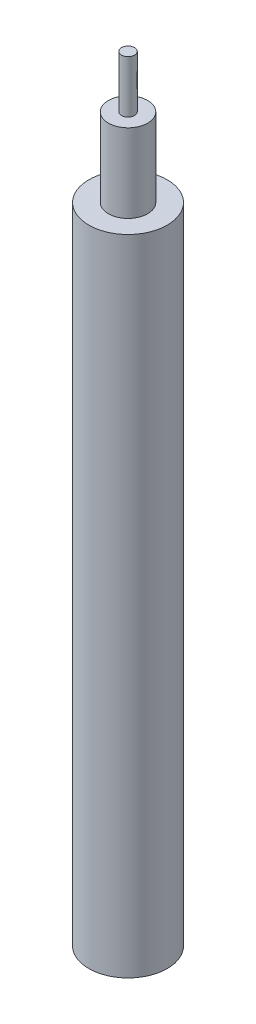
ISO-10303-21;
HEADER;
FILE_DESCRIPTION(('STEP AP214'),'2;1');
FILE_NAME('part.step','',(''),(''),'','','');
FILE_SCHEMA(('AUTOMOTIVE_DESIGN { 1 0 10303 214 1 1 1 1 }'));
ENDSEC;
DATA;
#1=APPLICATION_CONTEXT('core data for automotive mechanical design processes');
#2=APPLICATION_PROTOCOL_DEFINITION('international standard','automotive_design',2000,#1);
#3=PRODUCT_CONTEXT('',#1,'mechanical');
#4=PRODUCT('Part','Part','',(#3));
#5=PRODUCT_RELATED_PRODUCT_CATEGORY('part','',(#4));
#6=PRODUCT_DEFINITION_FORMATION('','',#4);
#7=PRODUCT_DEFINITION_CONTEXT('part definition',#1,'design');
#8=PRODUCT_DEFINITION('design','',#6,#7);
#9=PRODUCT_DEFINITION_SHAPE('','',#8);
#10=(LENGTH_UNIT() NAMED_UNIT(*) SI_UNIT(.MILLI.,.METRE.));
#11=(NAMED_UNIT(*) PLANE_ANGLE_UNIT() SI_UNIT($,.RADIAN.));
#12=(NAMED_UNIT(*) SI_UNIT($,.STERADIAN.) SOLID_ANGLE_UNIT());
#13=UNCERTAINTY_MEASURE_WITH_UNIT(LENGTH_MEASURE(1.E-05),#10,'distance_accuracy_value','');
#14=(GEOMETRIC_REPRESENTATION_CONTEXT(3) GLOBAL_UNCERTAINTY_ASSIGNED_CONTEXT((#13)) GLOBAL_UNIT_ASSIGNED_CONTEXT((#10,
#11,#12)) REPRESENTATION_CONTEXT('',''));
#15=CARTESIAN_POINT('',(0.,0.,0.));
#16=DIRECTION('',(0.,0.,1.));
#17=DIRECTION('',(1.,0.,0.));
#18=AXIS2_PLACEMENT_3D('',#15,#16,#17);
#19=CARTESIAN_POINT('',(0.,-9.525,0.));
#20=DIRECTION('',(0.,1.,0.));
#21=DIRECTION('',(0.,0.,1.));
#22=AXIS2_PLACEMENT_3D('',#19,#20,#21);
#23=CYLINDRICAL_SURFACE('',#22,2.38125);
#24=CARTESIAN_POINT('',(0.,-9.525,0.));
#25=DIRECTION('',(0.,1.,0.));
#26=DIRECTION('',(0.,0.,1.));
#27=AXIS2_PLACEMENT_3D('',#24,#25,#26);
#28=CIRCLE('',#27,2.38125);
#29=CARTESIAN_POINT('',(0.,-9.525,2.38125));
#30=VERTEX_POINT('',#29);
#31=EDGE_CURVE('E42',#30,#30,#28,.T.);
#32=CARTESIAN_POINT('',(0.,0.,0.));
#33=DIRECTION('',(0.,1.,0.));
#34=DIRECTION('',(0.,0.,1.));
#35=AXIS2_PLACEMENT_3D('',#32,#33,#34);
#36=CIRCLE('',#35,2.38125);
#37=CARTESIAN_POINT('',(0.,0.,2.38125));
#38=VERTEX_POINT('',#37);
#39=EDGE_CURVE('E34',#38,#38,#36,.T.);
#40=CARTESIAN_POINT('',(0.,-9.525,2.38125));
#41=CARTESIAN_POINT('',(0.,-9.42578125,2.38125));
#42=CARTESIAN_POINT('',(0.,-9.3265625,2.38125));
#43=CARTESIAN_POINT('',(0.,-9.128125,2.38125));
#44=CARTESIAN_POINT('',(0.,-9.02890625,2.38125));
#45=CARTESIAN_POINT('',(0.,-8.83046875,2.38125));
#46=CARTESIAN_POINT('',(0.,-8.73125,2.38125));
#47=CARTESIAN_POINT('',(0.,-8.5328125,2.38125));
#48=CARTESIAN_POINT('',(0.,-8.43359375,2.38125));
#49=CARTESIAN_POINT('',(0.,-8.23515625,2.38125));
#50=CARTESIAN_POINT('',(0.,-8.1359375,2.38125));
#51=CARTESIAN_POINT('',(0.,-7.9375,2.38125));
#52=CARTESIAN_POINT('',(0.,-7.83828125,2.38125));
#53=CARTESIAN_POINT('',(0.,-7.63984375,2.38125));
#54=CARTESIAN_POINT('',(0.,-7.540625,2.38125));
#55=CARTESIAN_POINT('',(0.,-7.3421875,2.38125));
#56=CARTESIAN_POINT('',(0.,-7.24296875,2.38125));
#57=CARTESIAN_POINT('',(0.,-7.04453125,2.38125));
#58=CARTESIAN_POINT('',(0.,-6.9453125,2.38125));
#59=CARTESIAN_POINT('',(0.,-6.746875,2.38125));
#60=CARTESIAN_POINT('',(0.,-6.64765625,2.38125));
#61=CARTESIAN_POINT('',(0.,-6.44921875,2.38125));
#62=CARTESIAN_POINT('',(0.,-6.35,2.38125));
#63=CARTESIAN_POINT('',(0.,-6.1515625,2.38125));
#64=CARTESIAN_POINT('',(0.,-6.05234375,2.38125));
#65=CARTESIAN_POINT('',(0.,-5.85390625,2.38125));
#66=CARTESIAN_POINT('',(0.,-5.7546875,2.38125));
#67=CARTESIAN_POINT('',(0.,-5.55625,2.38125));
#68=CARTESIAN_POINT('',(0.,-5.45703125,2.38125));
#69=CARTESIAN_POINT('',(0.,-5.25859375,2.38125));
#70=CARTESIAN_POINT('',(0.,-5.159375,2.38125));
#71=CARTESIAN_POINT('',(0.,-4.9609375,2.38125));
#72=CARTESIAN_POINT('',(0.,-4.86171875,2.38125));
#73=CARTESIAN_POINT('',(0.,-4.66328125,2.38125));
#74=CARTESIAN_POINT('',(0.,-4.5640625,2.38125));
#75=CARTESIAN_POINT('',(0.,-4.365625,2.38125));
#76=CARTESIAN_POINT('',(0.,-4.26640625,2.38125));
#77=CARTESIAN_POINT('',(0.,-4.06796875,2.38125));
#78=CARTESIAN_POINT('',(0.,-3.96875,2.38125));
#79=CARTESIAN_POINT('',(0.,-3.7703125,2.38125));
#80=CARTESIAN_POINT('',(0.,-3.67109375,2.38125));
#81=CARTESIAN_POINT('',(0.,-3.47265625,2.38125));
#82=CARTESIAN_POINT('',(0.,-3.3734375,2.38125));
#83=CARTESIAN_POINT('',(0.,-3.175,2.38125));
#84=CARTESIAN_POINT('',(0.,-3.07578125,2.38125));
#85=CARTESIAN_POINT('',(0.,-2.87734375,2.38125));
#86=CARTESIAN_POINT('',(0.,-2.778125,2.38125));
#87=CARTESIAN_POINT('',(0.,-2.5796875,2.38125));
#88=CARTESIAN_POINT('',(0.,-2.48046875,2.38125));
#89=CARTESIAN_POINT('',(0.,-2.28203125,2.38125));
#90=CARTESIAN_POINT('',(0.,-2.1828125,2.38125));
#91=CARTESIAN_POINT('',(0.,-1.984375,2.38125));
#92=CARTESIAN_POINT('',(0.,-1.88515625,2.38125));
#93=CARTESIAN_POINT('',(0.,-1.68671875,2.38125));
#94=CARTESIAN_POINT('',(0.,-1.5875,2.38125));
#95=CARTESIAN_POINT('',(0.,-1.3890625,2.38125));
#96=CARTESIAN_POINT('',(0.,-1.28984375,2.38125));
#97=CARTESIAN_POINT('',(0.,-1.09140625,2.38125));
#98=CARTESIAN_POINT('',(0.,-0.992187500000001,2.38125));
#99=CARTESIAN_POINT('',(0.,-0.793750000000001,2.38125));
#100=CARTESIAN_POINT('',(0.,-0.69453125,2.38125));
#101=CARTESIAN_POINT('',(0.,-0.49609375,2.38125));
#102=CARTESIAN_POINT('',(0.,-0.396875,2.38125));
#103=CARTESIAN_POINT('',(0.,-0.1984375,2.38125));
#104=CARTESIAN_POINT('',(0.,-0.0992187500000001,2.38125));
#105=CARTESIAN_POINT('',(0.,0.,2.38125));
#106=B_SPLINE_CURVE_WITH_KNOTS('',3,(#40,#41,#42,#43,#44,#45,#46,#47,#48,#49,#50,#51,#52,#53,
#54,#55,#56,#57,#58,#59,#60,#61,#62,#63,#64,#65,#66,#67,#68,#69,#70,#71,#72,#73,#74,#75,#76,#77,
#78,#79,#80,#81,#82,#83,#84,#85,#86,#87,#88,#89,#90,#91,#92,#93,#94,#95,#96,#97,#98,#99,#100,
#101,#102,#103,#104,#105),.UNSPECIFIED.,.F.,.F.,(4,2,2,2,2,2,2,2,2,2,2,2,2,2,2,2,2,2,2,2,2,2,2,
2,2,2,2,2,2,2,2,2,4),(0.,0.297656249999998,0.595312499999999,0.892968749999999,1.190625,
1.48828125,1.7859375,2.08359375,2.38125,2.67890625,2.9765625,3.27421875,3.571875,3.86953125,
4.1671875,4.46484375,4.7625,5.06015625,5.3578125,5.65546875,5.953125,6.25078125,6.5484375,
6.84609375,7.14375,7.44140625,7.7390625,8.03671875,8.334375,8.63203125,8.9296875,9.22734375,
9.525),.UNSPECIFIED.);
#107=EDGE_CURVE('BSEAM31',#30,#38,#106,.T.);
#108=ORIENTED_EDGE('',*,*,#31,.T.);
#109=ORIENTED_EDGE('',*,*,#39,.F.);
#110=ORIENTED_EDGE('',*,*,#107,.T.);
#111=ORIENTED_EDGE('',*,*,#107,.F.);
#112=EDGE_LOOP('',(#108,#110,#109,#111));
#113=FACE_BOUND('',#112,.T.);
#114=ADVANCED_FACE('F31',(#113),#23,.T.);
#115=CARTESIAN_POINT('',(0.,0.,0.));
#116=DIRECTION('',(0.,1.,0.));
#117=DIRECTION('',(0.,0.,1.));
#118=AXIS2_PLACEMENT_3D('',#115,#116,#117);
#119=PLANE('',#118);
#120=CARTESIAN_POINT('',(0.,0.,0.));
#121=DIRECTION('',(0.,1.,0.));
#122=DIRECTION('',(0.,0.,1.));
#123=AXIS2_PLACEMENT_3D('',#120,#121,#122);
#124=CIRCLE('',#123,0.79375);
#125=CARTESIAN_POINT('',(0.,0.,0.79375));
#126=VERTEX_POINT('',#125);
#127=EDGE_CURVE('E10',#126,#126,#124,.T.);
#128=ORIENTED_EDGE('',*,*,#127,.F.);
#129=EDGE_LOOP('',(#128));
#130=FACE_BOUND('',#129,.T.);
#131=ORIENTED_EDGE('',*,*,#39,.T.);
#132=EDGE_LOOP('',(#131));
#133=FACE_BOUND('',#132,.T.);
#134=ADVANCED_FACE('F66',(#130,#133),#119,.T.);
#135=CARTESIAN_POINT('',(0.,-87.63,0.));
#136=DIRECTION('',(0.,1.,0.));
#137=DIRECTION('',(0.,0.,1.));
#138=AXIS2_PLACEMENT_3D('',#135,#136,#137);
#139=CYLINDRICAL_SURFACE('',#138,4.7625);
#140=CARTESIAN_POINT('',(0.,-87.63,0.));
#141=DIRECTION('',(0.,-1.,0.));
#142=DIRECTION('',(0.,0.,-1.));
#143=AXIS2_PLACEMENT_3D('',#140,#141,#142);
#144=CIRCLE('',#143,4.7625);
#145=CARTESIAN_POINT('',(0.,-87.63,-4.7625));
#146=VERTEX_POINT('',#145);
#147=EDGE_CURVE('E46',#146,#146,#144,.T.);
#148=ORIENTED_EDGE('',*,*,#147,.F.);
#149=EDGE_LOOP('',(#148));
#150=FACE_BOUND('',#149,.T.);
#151=CARTESIAN_POINT('',(0.,-9.525,0.));
#152=DIRECTION('',(0.,-1.,0.));
#153=DIRECTION('',(0.,0.,-1.));
#154=AXIS2_PLACEMENT_3D('',#151,#152,#153);
#155=CIRCLE('',#154,4.7625);
#156=CARTESIAN_POINT('',(0.,-9.525,-4.7625));
#157=VERTEX_POINT('',#156);
#158=EDGE_CURVE('E49',#157,#157,#155,.T.);
#159=ORIENTED_EDGE('',*,*,#158,.T.);
#160=EDGE_LOOP('',(#159));
#161=FACE_BOUND('',#160,.T.);
#162=ADVANCED_FACE('F64',(#150,#161),#139,.T.);
#163=CARTESIAN_POINT('',(0.,-87.63,0.));
#164=DIRECTION('',(0.,-1.,0.));
#165=DIRECTION('',(0.,0.,-1.));
#166=AXIS2_PLACEMENT_3D('',#163,#164,#165);
#167=PLANE('',#166);
#168=ORIENTED_EDGE('',*,*,#147,.T.);
#169=EDGE_LOOP('',(#168));
#170=FACE_BOUND('',#169,.T.);
#171=ADVANCED_FACE('F60',(#170),#167,.T.);
#172=CARTESIAN_POINT('',(0.,-9.525,0.));
#173=DIRECTION('',(0.,-1.,0.));
#174=DIRECTION('',(0.,0.,-1.));
#175=AXIS2_PLACEMENT_3D('',#172,#173,#174);
#176=PLANE('',#175);
#177=ORIENTED_EDGE('',*,*,#31,.F.);
#178=EDGE_LOOP('',(#177));
#179=FACE_BOUND('',#178,.T.);
#180=ORIENTED_EDGE('',*,*,#158,.F.);
#181=EDGE_LOOP('',(#180));
#182=FACE_BOUND('',#181,.T.);
#183=ADVANCED_FACE('F56',(#179,#182),#176,.F.);
#184=CARTESIAN_POINT('',(0.,6.35,0.));
#185=DIRECTION('',(0.,-1.,0.));
#186=DIRECTION('',(0.,0.,-1.));
#187=AXIS2_PLACEMENT_3D('',#184,#185,#186);
#188=CYLINDRICAL_SURFACE('',#187,0.79375);
#189=CARTESIAN_POINT('',(0.,6.35,0.));
#190=DIRECTION('',(0.,1.,0.));
#191=DIRECTION('',(0.,0.,1.));
#192=AXIS2_PLACEMENT_3D('',#189,#190,#191);
#193=CIRCLE('',#192,0.79375);
#194=CARTESIAN_POINT('',(0.,6.35,0.79375));
#195=VERTEX_POINT('',#194);
#196=EDGE_CURVE('E45',#195,#195,#193,.T.);
#197=ORIENTED_EDGE('',*,*,#196,.F.);
#198=EDGE_LOOP('',(#197));
#199=FACE_BOUND('',#198,.T.);
#200=ORIENTED_EDGE('',*,*,#127,.T.);
#201=EDGE_LOOP('',(#200));
#202=FACE_BOUND('',#201,.T.);
#203=ADVANCED_FACE('F59',(#199,#202),#188,.T.);
#204=CARTESIAN_POINT('',(0.,6.35,0.));
#205=DIRECTION('',(0.,1.,0.));
#206=DIRECTION('',(0.,0.,1.));
#207=AXIS2_PLACEMENT_3D('',#204,#205,#206);
#208=PLANE('',#207);
#209=ORIENTED_EDGE('',*,*,#196,.T.);
#210=EDGE_LOOP('',(#209));
#211=FACE_BOUND('',#210,.T.);
#212=ADVANCED_FACE('F98',(#211),#208,.T.);
#213=CLOSED_SHELL('',(#114,#134,#162,#171,#183,#203,#212));
#214=MANIFOLD_SOLID_BREP('B2',#213);
#215=ADVANCED_BREP_SHAPE_REPRESENTATION('',(#18,#214),#14);
#216=SHAPE_DEFINITION_REPRESENTATION(#9,#215);
ENDSEC;
END-ISO-10303-21;
